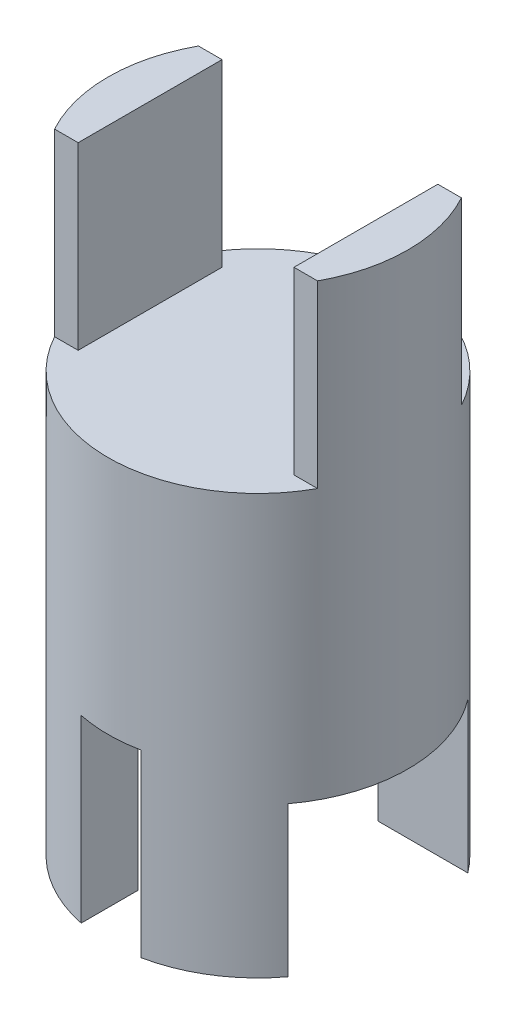
ISO-10303-21;
HEADER;
FILE_DESCRIPTION(('STEP AP214'),'2;1');
FILE_NAME('part.step','',(''),(''),'','','');
FILE_SCHEMA(('AUTOMOTIVE_DESIGN { 1 0 10303 214 1 1 1 1 }'));
ENDSEC;
DATA;
#1=APPLICATION_CONTEXT('core data for automotive mechanical design processes');
#2=APPLICATION_PROTOCOL_DEFINITION('international standard','automotive_design',2000,#1);
#3=PRODUCT_CONTEXT('',#1,'mechanical');
#4=PRODUCT('Part','Part','',(#3));
#5=PRODUCT_RELATED_PRODUCT_CATEGORY('part','',(#4));
#6=PRODUCT_DEFINITION_FORMATION('','',#4);
#7=PRODUCT_DEFINITION_CONTEXT('part definition',#1,'design');
#8=PRODUCT_DEFINITION('design','',#6,#7);
#9=PRODUCT_DEFINITION_SHAPE('','',#8);
#10=(LENGTH_UNIT() NAMED_UNIT(*) SI_UNIT(.MILLI.,.METRE.));
#11=(NAMED_UNIT(*) PLANE_ANGLE_UNIT() SI_UNIT($,.RADIAN.));
#12=(NAMED_UNIT(*) SI_UNIT($,.STERADIAN.) SOLID_ANGLE_UNIT());
#13=UNCERTAINTY_MEASURE_WITH_UNIT(LENGTH_MEASURE(1.E-05),#10,'distance_accuracy_value','');
#14=(GEOMETRIC_REPRESENTATION_CONTEXT(3) GLOBAL_UNCERTAINTY_ASSIGNED_CONTEXT((#13)) GLOBAL_UNIT_ASSIGNED_CONTEXT((#10,
#11,#12)) REPRESENTATION_CONTEXT('',''));
#15=CARTESIAN_POINT('',(0.,0.,0.));
#16=DIRECTION('',(0.,0.,1.));
#17=DIRECTION('',(1.,0.,0.));
#18=AXIS2_PLACEMENT_3D('',#15,#16,#17);
#19=CARTESIAN_POINT('',(0.,75.,0.));
#20=DIRECTION('',(0.,1.,0.));
#21=DIRECTION('',(0.,0.,1.));
#22=AXIS2_PLACEMENT_3D('',#19,#20,#21);
#23=PLANE('',#22);
#24=DIRECTION('',(0.,0.,1.));
#25=VECTOR('',#24,1.);
#26=CARTESIAN_POINT('',(-18.,75.,-25.));
#27=LINE('',#26,#25);
#28=CARTESIAN_POINT('',(-18.,75.,-12.));
#29=VERTEX_POINT('',#28);
#30=CARTESIAN_POINT('',(-18.,75.,12.));
#31=VERTEX_POINT('',#30);
#32=EDGE_CURVE('E182',#29,#31,#27,.T.);
#33=ORIENTED_EDGE('',*,*,#32,.F.);
#34=DIRECTION('',(1.,0.,0.));
#35=VECTOR('',#34,1.);
#36=CARTESIAN_POINT('',(0.,75.,-12.));
#37=LINE('',#36,#35);
#38=CARTESIAN_POINT('',(-21.9317121994613,75.,-12.));
#39=VERTEX_POINT('',#38);
#40=EDGE_CURVE('E197',#39,#29,#37,.T.);
#41=ORIENTED_EDGE('',*,*,#40,.F.);
#42=CARTESIAN_POINT('',(0.,75.,0.));
#43=DIRECTION('',(0.,1.,0.));
#44=DIRECTION('',(0.,0.,1.));
#45=AXIS2_PLACEMENT_3D('',#42,#43,#44);
#46=CIRCLE('',#45,25.);
#47=CARTESIAN_POINT('',(-21.9317121994613,75.,12.));
#48=VERTEX_POINT('',#47);
#49=EDGE_CURVE('E285',#39,#48,#46,.T.);
#50=ORIENTED_EDGE('',*,*,#49,.T.);
#51=DIRECTION('',(-1.,0.,0.));
#52=VECTOR('',#51,1.);
#53=CARTESIAN_POINT('',(0.,75.,12.));
#54=LINE('',#53,#52);
#55=EDGE_CURVE('E201',#31,#48,#54,.T.);
#56=ORIENTED_EDGE('',*,*,#55,.F.);
#57=EDGE_LOOP('',(#33,#41,#50,#56));
#58=FACE_BOUND('',#57,.T.);
#59=ADVANCED_FACE('F39',(#58),#23,.T.);
#60=CARTESIAN_POINT('',(-25.,75.,-12.));
#61=DIRECTION('',(0.,0.,1.));
#62=DIRECTION('',(0.,-1.,0.));
#63=AXIS2_PLACEMENT_3D('',#60,#61,#62);
#64=PLANE('',#63);
#65=ORIENTED_EDGE('',*,*,#40,.T.);
#66=DIRECTION('',(0.,-1.,0.));
#67=VECTOR('',#66,1.);
#68=CARTESIAN_POINT('',(-18.,75.,-12.));
#69=LINE('',#68,#67);
#70=CARTESIAN_POINT('',(-18.,45.,-12.));
#71=VERTEX_POINT('',#70);
#72=EDGE_CURVE('E345',#29,#71,#69,.T.);
#73=ORIENTED_EDGE('',*,*,#72,.T.);
#74=DIRECTION('',(1.,0.,0.));
#75=VECTOR('',#74,1.);
#76=CARTESIAN_POINT('',(-25.,45.,-12.));
#77=LINE('',#76,#75);
#78=CARTESIAN_POINT('',(-21.9317121994613,45.,-12.));
#79=VERTEX_POINT('',#78);
#80=EDGE_CURVE('E246',#79,#71,#77,.T.);
#81=ORIENTED_EDGE('',*,*,#80,.F.);
#82=DIRECTION('',(0.,1.,0.));
#83=VECTOR('',#82,1.);
#84=CARTESIAN_POINT('',(-21.9317121994613,-25.,-12.));
#85=LINE('',#84,#83);
#86=EDGE_CURVE('E254',#79,#39,#85,.T.);
#87=ORIENTED_EDGE('',*,*,#86,.T.);
#88=EDGE_LOOP('',(#65,#73,#81,#87));
#89=FACE_BOUND('',#88,.T.);
#90=ADVANCED_FACE('F374',(#89),#64,.F.);
#91=CARTESIAN_POINT('',(-25.,75.,12.));
#92=DIRECTION('',(0.,0.,-1.));
#93=DIRECTION('',(0.,1.,0.));
#94=AXIS2_PLACEMENT_3D('',#91,#92,#93);
#95=PLANE('',#94);
#96=DIRECTION('',(1.,0.,0.));
#97=VECTOR('',#96,1.);
#98=CARTESIAN_POINT('',(-25.,45.,12.));
#99=LINE('',#98,#97);
#100=CARTESIAN_POINT('',(-21.9317121994613,45.,12.));
#101=VERTEX_POINT('',#100);
#102=CARTESIAN_POINT('',(-18.,45.,12.));
#103=VERTEX_POINT('',#102);
#104=EDGE_CURVE('E252',#101,#103,#99,.T.);
#105=ORIENTED_EDGE('',*,*,#104,.T.);
#106=DIRECTION('',(0.,1.,0.));
#107=VECTOR('',#106,1.);
#108=CARTESIAN_POINT('',(-18.,75.,12.));
#109=LINE('',#108,#107);
#110=EDGE_CURVE('E191',#103,#31,#109,.T.);
#111=ORIENTED_EDGE('',*,*,#110,.T.);
#112=ORIENTED_EDGE('',*,*,#55,.T.);
#113=DIRECTION('',(0.,1.,0.));
#114=VECTOR('',#113,1.);
#115=CARTESIAN_POINT('',(-21.9317121994613,-25.,12.));
#116=LINE('',#115,#114);
#117=EDGE_CURVE('E263',#48,#101,#116,.F.);
#118=ORIENTED_EDGE('',*,*,#117,.T.);
#119=EDGE_LOOP('',(#105,#111,#112,#118));
#120=FACE_BOUND('',#119,.T.);
#121=ADVANCED_FACE('F364',(#120),#95,.F.);
#122=CARTESIAN_POINT('',(0.,-25.,0.));
#123=DIRECTION('',(0.,1.,0.));
#124=DIRECTION('',(0.,0.,1.));
#125=AXIS2_PLACEMENT_3D('',#122,#123,#124);
#126=PLANE('',#125);
#127=DIRECTION('',(1.,0.,0.));
#128=VECTOR('',#127,1.);
#129=CARTESIAN_POINT('',(0.,-25.,15.));
#130=LINE('',#129,#128);
#131=CARTESIAN_POINT('',(-20.,-25.,15.));
#132=VERTEX_POINT('',#131);
#133=CARTESIAN_POINT('',(-5.,-25.,15.));
#134=VERTEX_POINT('',#133);
#135=EDGE_CURVE('E296',#132,#134,#130,.T.);
#136=ORIENTED_EDGE('',*,*,#135,.T.);
#137=DIRECTION('',(0.,0.,1.));
#138=VECTOR('',#137,1.);
#139=CARTESIAN_POINT('',(-5.,-25.,-25.));
#140=LINE('',#139,#138);
#141=CARTESIAN_POINT('',(-5.,-25.,24.4948974278318));
#142=VERTEX_POINT('',#141);
#143=EDGE_CURVE('E238',#134,#142,#140,.T.);
#144=ORIENTED_EDGE('',*,*,#143,.T.);
#145=CARTESIAN_POINT('',(0.,-25.,0.));
#146=DIRECTION('',(0.,1.,0.));
#147=DIRECTION('',(0.,0.,1.));
#148=AXIS2_PLACEMENT_3D('',#145,#146,#147);
#149=CIRCLE('',#148,25.);
#150=EDGE_CURVE('E244',#132,#142,#149,.T.);
#151=ORIENTED_EDGE('',*,*,#150,.F.);
#152=EDGE_LOOP('',(#136,#144,#151));
#153=FACE_BOUND('',#152,.T.);
#154=ADVANCED_FACE('F390',(#153),#126,.F.);
#155=CARTESIAN_POINT('',(-5.,-25.,-24.4948974278318));
#156=VERTEX_POINT('',#155);
#157=CARTESIAN_POINT('',(-20.,-25.,-15.));
#158=VERTEX_POINT('',#157);
#159=EDGE_CURVE('E289',#156,#158,#149,.T.);
#160=ORIENTED_EDGE('',*,*,#159,.F.);
#161=CARTESIAN_POINT('',(-5.,-25.,-15.));
#162=VERTEX_POINT('',#161);
#163=EDGE_CURVE('E324',#156,#162,#140,.T.);
#164=ORIENTED_EDGE('',*,*,#163,.T.);
#165=DIRECTION('',(-1.,0.,0.));
#166=VECTOR('',#165,1.);
#167=CARTESIAN_POINT('',(0.,-25.,-15.));
#168=LINE('',#167,#166);
#169=EDGE_CURVE('E295',#162,#158,#168,.T.);
#170=ORIENTED_EDGE('',*,*,#169,.T.);
#171=EDGE_LOOP('',(#160,#164,#170));
#172=FACE_BOUND('',#171,.T.);
#173=ADVANCED_FACE('F323',(#172),#126,.F.);
#174=CARTESIAN_POINT('',(-25.,-25.,15.));
#175=DIRECTION('',(0.,0.,1.));
#176=DIRECTION('',(1.,0.,0.));
#177=AXIS2_PLACEMENT_3D('',#174,#175,#176);
#178=PLANE('',#177);
#179=DIRECTION('',(1.,0.,0.));
#180=VECTOR('',#179,1.);
#181=CARTESIAN_POINT('',(-25.,0.,15.));
#182=LINE('',#181,#180);
#183=CARTESIAN_POINT('',(-20.,0.,15.));
#184=VERTEX_POINT('',#183);
#185=CARTESIAN_POINT('',(-5.,0.,15.));
#186=VERTEX_POINT('',#185);
#187=EDGE_CURVE('E267',#184,#186,#182,.T.);
#188=ORIENTED_EDGE('',*,*,#187,.T.);
#189=DIRECTION('',(0.,-1.,0.));
#190=VECTOR('',#189,1.);
#191=CARTESIAN_POINT('',(-5.,-25.,15.));
#192=LINE('',#191,#190);
#193=EDGE_CURVE('E248',#186,#134,#192,.T.);
#194=ORIENTED_EDGE('',*,*,#193,.T.);
#195=ORIENTED_EDGE('',*,*,#135,.F.);
#196=DIRECTION('',(0.,1.,0.));
#197=VECTOR('',#196,1.);
#198=CARTESIAN_POINT('',(-20.,-25.,15.));
#199=LINE('',#198,#197);
#200=EDGE_CURVE('E279',#132,#184,#199,.T.);
#201=ORIENTED_EDGE('',*,*,#200,.T.);
#202=EDGE_LOOP('',(#188,#194,#195,#201));
#203=FACE_BOUND('',#202,.T.);
#204=ADVANCED_FACE('F329',(#203),#178,.F.);
#205=CARTESIAN_POINT('',(-25.,0.,15.));
#206=DIRECTION('',(0.,1.,0.));
#207=DIRECTION('',(0.,0.,1.));
#208=AXIS2_PLACEMENT_3D('',#205,#206,#207);
#209=PLANE('',#208);
#210=DIRECTION('',(1.,0.,0.));
#211=VECTOR('',#210,1.);
#212=CARTESIAN_POINT('',(-25.,0.,-15.));
#213=LINE('',#212,#211);
#214=CARTESIAN_POINT('',(-20.,0.,-15.));
#215=VERTEX_POINT('',#214);
#216=CARTESIAN_POINT('',(-5.,0.,-15.));
#217=VERTEX_POINT('',#216);
#218=EDGE_CURVE('E272',#215,#217,#213,.T.);
#219=ORIENTED_EDGE('',*,*,#218,.T.);
#220=DIRECTION('',(0.,0.,1.));
#221=VECTOR('',#220,1.);
#222=CARTESIAN_POINT('',(-5.,0.,15.));
#223=LINE('',#222,#221);
#224=EDGE_CURVE('E333',#217,#186,#223,.T.);
#225=ORIENTED_EDGE('',*,*,#224,.T.);
#226=ORIENTED_EDGE('',*,*,#187,.F.);
#227=CARTESIAN_POINT('',(0.,0.,0.));
#228=DIRECTION('',(0.,1.,0.));
#229=DIRECTION('',(0.,0.,1.));
#230=AXIS2_PLACEMENT_3D('',#227,#228,#229);
#231=CIRCLE('',#230,25.);
#232=EDGE_CURVE('E198',#184,#215,#231,.F.);
#233=ORIENTED_EDGE('',*,*,#232,.T.);
#234=EDGE_LOOP('',(#219,#225,#226,#233));
#235=FACE_BOUND('',#234,.T.);
#236=ADVANCED_FACE('F332',(#235),#209,.F.);
#237=CARTESIAN_POINT('',(-25.,-25.,-15.));
#238=DIRECTION('',(0.,0.,-1.));
#239=DIRECTION('',(-1.,0.,0.));
#240=AXIS2_PLACEMENT_3D('',#237,#238,#239);
#241=PLANE('',#240);
#242=ORIENTED_EDGE('',*,*,#169,.F.);
#243=DIRECTION('',(0.,1.,0.));
#244=VECTOR('',#243,1.);
#245=CARTESIAN_POINT('',(-5.,-25.,-15.));
#246=LINE('',#245,#244);
#247=EDGE_CURVE('E213',#162,#217,#246,.T.);
#248=ORIENTED_EDGE('',*,*,#247,.T.);
#249=ORIENTED_EDGE('',*,*,#218,.F.);
#250=DIRECTION('',(0.,1.,0.));
#251=VECTOR('',#250,1.);
#252=CARTESIAN_POINT('',(-20.,-25.,-15.));
#253=LINE('',#252,#251);
#254=EDGE_CURVE('E276',#215,#158,#253,.F.);
#255=ORIENTED_EDGE('',*,*,#254,.T.);
#256=EDGE_LOOP('',(#242,#248,#249,#255));
#257=FACE_BOUND('',#256,.T.);
#258=ADVANCED_FACE('F325',(#257),#241,.F.);
#259=CARTESIAN_POINT('',(5.,-25.,24.4948974278318));
#260=VERTEX_POINT('',#259);
#261=CARTESIAN_POINT('',(20.,-25.,15.));
#262=VERTEX_POINT('',#261);
#263=EDGE_CURVE('E290',#260,#262,#149,.T.);
#264=ORIENTED_EDGE('',*,*,#263,.F.);
#265=DIRECTION('',(0.,0.,1.));
#266=VECTOR('',#265,1.);
#267=CARTESIAN_POINT('',(5.,-25.,-25.));
#268=LINE('',#267,#266);
#269=CARTESIAN_POINT('',(5.,-25.,15.));
#270=VERTEX_POINT('',#269);
#271=EDGE_CURVE('E306',#270,#260,#268,.T.);
#272=ORIENTED_EDGE('',*,*,#271,.F.);
#273=EDGE_CURVE('E294',#270,#262,#130,.T.);
#274=ORIENTED_EDGE('',*,*,#273,.T.);
#275=EDGE_LOOP('',(#264,#272,#274));
#276=FACE_BOUND('',#275,.T.);
#277=ADVANCED_FACE('F305',(#276),#126,.F.);
#278=CARTESIAN_POINT('',(0.,-25.,0.));
#279=DIRECTION('',(0.,1.,0.));
#280=DIRECTION('',(0.,0.,1.));
#281=AXIS2_PLACEMENT_3D('',#278,#279,#280);
#282=CYLINDRICAL_SURFACE('',#281,25.);
#283=DIRECTION('',(0.,1.,0.));
#284=VECTOR('',#283,1.);
#285=CARTESIAN_POINT('',(-5.,-25.,24.4948974278318));
#286=LINE('',#285,#284);
#287=CARTESIAN_POINT('',(-5.,5.,24.4948974278318));
#288=VERTEX_POINT('',#287);
#289=EDGE_CURVE('E234',#288,#142,#286,.F.);
#290=ORIENTED_EDGE('',*,*,#289,.F.);
#291=CARTESIAN_POINT('',(0.,5.,0.));
#292=DIRECTION('',(0.,1.,0.));
#293=DIRECTION('',(0.,0.,1.));
#294=AXIS2_PLACEMENT_3D('',#291,#292,#293);
#295=CIRCLE('',#294,25.);
#296=CARTESIAN_POINT('',(5.,5.,24.4948974278318));
#297=VERTEX_POINT('',#296);
#298=EDGE_CURVE('E43',#297,#288,#295,.F.);
#299=ORIENTED_EDGE('',*,*,#298,.F.);
#300=DIRECTION('',(0.,1.,0.));
#301=VECTOR('',#300,1.);
#302=CARTESIAN_POINT('',(5.,-25.,24.4948974278318));
#303=LINE('',#302,#301);
#304=EDGE_CURVE('E314',#260,#297,#303,.T.);
#305=ORIENTED_EDGE('',*,*,#304,.F.);
#306=ORIENTED_EDGE('',*,*,#263,.T.);
#307=DIRECTION('',(0.,1.,0.));
#308=VECTOR('',#307,1.);
#309=CARTESIAN_POINT('',(20.,-25.,15.));
#310=LINE('',#309,#308);
#311=CARTESIAN_POINT('',(20.,0.,15.));
#312=VERTEX_POINT('',#311);
#313=EDGE_CURVE('E282',#312,#262,#310,.F.);
#314=ORIENTED_EDGE('',*,*,#313,.F.);
#315=CARTESIAN_POINT('',(20.,0.,-15.));
#316=VERTEX_POINT('',#315);
#317=EDGE_CURVE('E202',#316,#312,#231,.F.);
#318=ORIENTED_EDGE('',*,*,#317,.F.);
#319=DIRECTION('',(0.,1.,0.));
#320=VECTOR('',#319,1.);
#321=CARTESIAN_POINT('',(20.,-25.,-15.));
#322=LINE('',#321,#320);
#323=CARTESIAN_POINT('',(20.,-25.,-15.));
#324=VERTEX_POINT('',#323);
#325=EDGE_CURVE('E270',#324,#316,#322,.T.);
#326=ORIENTED_EDGE('',*,*,#325,.F.);
#327=CARTESIAN_POINT('',(5.,-25.,-24.4948974278318));
#328=VERTEX_POINT('',#327);
#329=EDGE_CURVE('E291',#324,#328,#149,.T.);
#330=ORIENTED_EDGE('',*,*,#329,.T.);
#331=DIRECTION('',(0.,1.,0.));
#332=VECTOR('',#331,1.);
#333=CARTESIAN_POINT('',(5.,-25.,-24.4948974278318));
#334=LINE('',#333,#332);
#335=CARTESIAN_POINT('',(5.,5.,-24.4948974278318));
#336=VERTEX_POINT('',#335);
#337=EDGE_CURVE('E334',#336,#328,#334,.F.);
#338=ORIENTED_EDGE('',*,*,#337,.F.);
#339=CARTESIAN_POINT('',(-5.,5.,-24.4948974278318));
#340=VERTEX_POINT('',#339);
#341=EDGE_CURVE('E11',#340,#336,#295,.F.);
#342=ORIENTED_EDGE('',*,*,#341,.F.);
#343=DIRECTION('',(0.,1.,0.));
#344=VECTOR('',#343,1.);
#345=CARTESIAN_POINT('',(-5.,-25.,-24.4948974278318));
#346=LINE('',#345,#344);
#347=EDGE_CURVE('E237',#156,#340,#346,.T.);
#348=ORIENTED_EDGE('',*,*,#347,.F.);
#349=ORIENTED_EDGE('',*,*,#159,.T.);
#350=ORIENTED_EDGE('',*,*,#254,.F.);
#351=ORIENTED_EDGE('',*,*,#232,.F.);
#352=ORIENTED_EDGE('',*,*,#200,.F.);
#353=ORIENTED_EDGE('',*,*,#150,.T.);
#354=EDGE_LOOP('',(#290,#299,#305,#306,#314,#318,#326,#330,#338,#342,#348,#349,#350,#351,#352,#353));
#355=FACE_BOUND('',#354,.T.);
#356=ORIENTED_EDGE('',*,*,#117,.F.);
#357=ORIENTED_EDGE('',*,*,#49,.F.);
#358=ORIENTED_EDGE('',*,*,#86,.F.);
#359=CARTESIAN_POINT('',(0.,45.,0.));
#360=DIRECTION('',(0.,-1.,0.));
#361=DIRECTION('',(0.,0.,-1.));
#362=AXIS2_PLACEMENT_3D('',#359,#360,#361);
#363=CIRCLE('',#362,25.);
#364=CARTESIAN_POINT('',(21.9317121994613,45.,-12.));
#365=VERTEX_POINT('',#364);
#366=EDGE_CURVE('E208',#365,#79,#363,.F.);
#367=ORIENTED_EDGE('',*,*,#366,.F.);
#368=DIRECTION('',(0.,1.,0.));
#369=VECTOR('',#368,1.);
#370=CARTESIAN_POINT('',(21.9317121994613,-25.,-12.));
#371=LINE('',#370,#369);
#372=CARTESIAN_POINT('',(21.9317121994613,75.,-12.));
#373=VERTEX_POINT('',#372);
#374=EDGE_CURVE('E259',#373,#365,#371,.F.);
#375=ORIENTED_EDGE('',*,*,#374,.F.);
#376=CARTESIAN_POINT('',(21.9317121994613,75.,12.));
#377=VERTEX_POINT('',#376);
#378=EDGE_CURVE('E196',#377,#373,#46,.T.);
#379=ORIENTED_EDGE('',*,*,#378,.F.);
#380=DIRECTION('',(0.,1.,0.));
#381=VECTOR('',#380,1.);
#382=CARTESIAN_POINT('',(21.9317121994613,-25.,12.));
#383=LINE('',#382,#381);
#384=CARTESIAN_POINT('',(21.9317121994613,45.,12.));
#385=VERTEX_POINT('',#384);
#386=EDGE_CURVE('E261',#385,#377,#383,.T.);
#387=ORIENTED_EDGE('',*,*,#386,.F.);
#388=CARTESIAN_POINT('',(0.,45.,0.));
#389=DIRECTION('',(0.,-1.,0.));
#390=DIRECTION('',(0.,0.,-1.));
#391=AXIS2_PLACEMENT_3D('',#388,#389,#390);
#392=CIRCLE('',#391,25.);
#393=EDGE_CURVE('E210',#101,#385,#392,.F.);
#394=ORIENTED_EDGE('',*,*,#393,.F.);
#395=EDGE_LOOP('',(#356,#357,#358,#367,#375,#379,#387,#394));
#396=FACE_BOUND('',#395,.T.);
#397=ADVANCED_FACE('F41',(#355,#396),#282,.T.);
#398=CARTESIAN_POINT('',(5.,-25.,-15.));
#399=VERTEX_POINT('',#398);
#400=EDGE_CURVE('E292',#324,#399,#168,.T.);
#401=ORIENTED_EDGE('',*,*,#400,.T.);
#402=EDGE_CURVE('E62',#328,#399,#268,.T.);
#403=ORIENTED_EDGE('',*,*,#402,.F.);
#404=ORIENTED_EDGE('',*,*,#329,.F.);
#405=EDGE_LOOP('',(#401,#403,#404));
#406=FACE_BOUND('',#405,.T.);
#407=ADVANCED_FACE('F399',(#406),#126,.F.);
#408=DIRECTION('',(0.,0.,1.));
#409=VECTOR('',#408,1.);
#410=CARTESIAN_POINT('',(18.,75.,-25.));
#411=LINE('',#410,#409);
#412=CARTESIAN_POINT('',(18.,75.,-12.));
#413=VERTEX_POINT('',#412);
#414=CARTESIAN_POINT('',(18.,75.,12.));
#415=VERTEX_POINT('',#414);
#416=EDGE_CURVE('E173',#413,#415,#411,.T.);
#417=ORIENTED_EDGE('',*,*,#416,.T.);
#418=EDGE_CURVE('E206',#377,#415,#54,.T.);
#419=ORIENTED_EDGE('',*,*,#418,.F.);
#420=ORIENTED_EDGE('',*,*,#378,.T.);
#421=EDGE_CURVE('E188',#413,#373,#37,.T.);
#422=ORIENTED_EDGE('',*,*,#421,.F.);
#423=EDGE_LOOP('',(#417,#419,#420,#422));
#424=FACE_BOUND('',#423,.T.);
#425=ADVANCED_FACE('F194',(#424),#23,.T.);
#426=ORIENTED_EDGE('',*,*,#273,.F.);
#427=DIRECTION('',(0.,1.,0.));
#428=VECTOR('',#427,1.);
#429=CARTESIAN_POINT('',(5.,-25.,15.));
#430=LINE('',#429,#428);
#431=CARTESIAN_POINT('',(5.,0.,15.));
#432=VERTEX_POINT('',#431);
#433=EDGE_CURVE('E339',#270,#432,#430,.T.);
#434=ORIENTED_EDGE('',*,*,#433,.T.);
#435=EDGE_CURVE('E271',#432,#312,#182,.T.);
#436=ORIENTED_EDGE('',*,*,#435,.T.);
#437=ORIENTED_EDGE('',*,*,#313,.T.);
#438=EDGE_LOOP('',(#426,#434,#436,#437));
#439=FACE_BOUND('',#438,.T.);
#440=ADVANCED_FACE('F310',(#439),#178,.F.);
#441=ORIENTED_EDGE('',*,*,#435,.F.);
#442=DIRECTION('',(0.,0.,-1.));
#443=VECTOR('',#442,1.);
#444=CARTESIAN_POINT('',(5.,0.,15.));
#445=LINE('',#444,#443);
#446=CARTESIAN_POINT('',(5.,0.,-15.));
#447=VERTEX_POINT('',#446);
#448=EDGE_CURVE('E341',#432,#447,#445,.T.);
#449=ORIENTED_EDGE('',*,*,#448,.T.);
#450=EDGE_CURVE('E266',#447,#316,#213,.T.);
#451=ORIENTED_EDGE('',*,*,#450,.T.);
#452=ORIENTED_EDGE('',*,*,#317,.T.);
#453=EDGE_LOOP('',(#441,#449,#451,#452));
#454=FACE_BOUND('',#453,.T.);
#455=ADVANCED_FACE('F404',(#454),#209,.F.);
#456=ORIENTED_EDGE('',*,*,#450,.F.);
#457=DIRECTION('',(0.,-1.,0.));
#458=VECTOR('',#457,1.);
#459=CARTESIAN_POINT('',(5.,-25.,-15.));
#460=LINE('',#459,#458);
#461=EDGE_CURVE('E212',#447,#399,#460,.T.);
#462=ORIENTED_EDGE('',*,*,#461,.T.);
#463=ORIENTED_EDGE('',*,*,#400,.F.);
#464=ORIENTED_EDGE('',*,*,#325,.T.);
#465=EDGE_LOOP('',(#456,#462,#463,#464));
#466=FACE_BOUND('',#465,.T.);
#467=ADVANCED_FACE('F386',(#466),#241,.F.);
#468=CARTESIAN_POINT('',(18.,45.,-12.));
#469=VERTEX_POINT('',#468);
#470=EDGE_CURVE('E190',#469,#365,#77,.T.);
#471=ORIENTED_EDGE('',*,*,#470,.F.);
#472=DIRECTION('',(0.,1.,0.));
#473=VECTOR('',#472,1.);
#474=CARTESIAN_POINT('',(18.,75.,-12.));
#475=LINE('',#474,#473);
#476=EDGE_CURVE('E176',#469,#413,#475,.T.);
#477=ORIENTED_EDGE('',*,*,#476,.T.);
#478=ORIENTED_EDGE('',*,*,#421,.T.);
#479=ORIENTED_EDGE('',*,*,#374,.T.);
#480=EDGE_LOOP('',(#471,#477,#478,#479));
#481=FACE_BOUND('',#480,.T.);
#482=ADVANCED_FACE('F186',(#481),#64,.F.);
#483=ORIENTED_EDGE('',*,*,#418,.T.);
#484=DIRECTION('',(0.,-1.,0.));
#485=VECTOR('',#484,1.);
#486=CARTESIAN_POINT('',(18.,75.,12.));
#487=LINE('',#486,#485);
#488=CARTESIAN_POINT('',(18.,45.,12.));
#489=VERTEX_POINT('',#488);
#490=EDGE_CURVE('E177',#415,#489,#487,.T.);
#491=ORIENTED_EDGE('',*,*,#490,.T.);
#492=EDGE_CURVE('E255',#489,#385,#99,.T.);
#493=ORIENTED_EDGE('',*,*,#492,.T.);
#494=ORIENTED_EDGE('',*,*,#386,.T.);
#495=EDGE_LOOP('',(#483,#491,#493,#494));
#496=FACE_BOUND('',#495,.T.);
#497=ADVANCED_FACE('F378',(#496),#95,.F.);
#498=CARTESIAN_POINT('',(-25.,45.,25.));
#499=DIRECTION('',(0.,-1.,0.));
#500=DIRECTION('',(0.,0.,-1.));
#501=AXIS2_PLACEMENT_3D('',#498,#499,#500);
#502=PLANE('',#501);
#503=ORIENTED_EDGE('',*,*,#492,.F.);
#504=DIRECTION('',(0.,0.,1.));
#505=VECTOR('',#504,1.);
#506=CARTESIAN_POINT('',(18.,45.,-25.));
#507=LINE('',#506,#505);
#508=EDGE_CURVE('E54',#469,#489,#507,.T.);
#509=ORIENTED_EDGE('',*,*,#508,.F.);
#510=ORIENTED_EDGE('',*,*,#470,.T.);
#511=ORIENTED_EDGE('',*,*,#366,.T.);
#512=ORIENTED_EDGE('',*,*,#80,.T.);
#513=DIRECTION('',(0.,0.,1.));
#514=VECTOR('',#513,1.);
#515=CARTESIAN_POINT('',(-18.,45.,-25.));
#516=LINE('',#515,#514);
#517=EDGE_CURVE('E353',#71,#103,#516,.T.);
#518=ORIENTED_EDGE('',*,*,#517,.T.);
#519=ORIENTED_EDGE('',*,*,#104,.F.);
#520=ORIENTED_EDGE('',*,*,#393,.T.);
#521=EDGE_LOOP('',(#503,#509,#510,#511,#512,#518,#519,#520));
#522=FACE_BOUND('',#521,.T.);
#523=ADVANCED_FACE('F360',(#522),#502,.F.);
#524=CARTESIAN_POINT('',(-5.,-25.,-25.));
#525=DIRECTION('',(-1.,0.,0.));
#526=DIRECTION('',(0.,0.,1.));
#527=AXIS2_PLACEMENT_3D('',#524,#525,#526);
#528=PLANE('',#527);
#529=ORIENTED_EDGE('',*,*,#289,.T.);
#530=ORIENTED_EDGE('',*,*,#143,.F.);
#531=ORIENTED_EDGE('',*,*,#193,.F.);
#532=ORIENTED_EDGE('',*,*,#224,.F.);
#533=ORIENTED_EDGE('',*,*,#247,.F.);
#534=ORIENTED_EDGE('',*,*,#163,.F.);
#535=ORIENTED_EDGE('',*,*,#347,.T.);
#536=DIRECTION('',(0.,0.,1.));
#537=VECTOR('',#536,1.);
#538=CARTESIAN_POINT('',(-5.,5.,-25.));
#539=LINE('',#538,#537);
#540=EDGE_CURVE('E225',#340,#288,#539,.T.);
#541=ORIENTED_EDGE('',*,*,#540,.T.);
#542=EDGE_LOOP('',(#529,#530,#531,#532,#533,#534,#535,#541));
#543=FACE_BOUND('',#542,.T.);
#544=ADVANCED_FACE('F233',(#543),#528,.F.);
#545=CARTESIAN_POINT('',(5.,-25.,-25.));
#546=DIRECTION('',(1.,0.,0.));
#547=DIRECTION('',(0.,0.,-1.));
#548=AXIS2_PLACEMENT_3D('',#545,#546,#547);
#549=PLANE('',#548);
#550=ORIENTED_EDGE('',*,*,#337,.T.);
#551=ORIENTED_EDGE('',*,*,#402,.T.);
#552=ORIENTED_EDGE('',*,*,#461,.F.);
#553=ORIENTED_EDGE('',*,*,#448,.F.);
#554=ORIENTED_EDGE('',*,*,#433,.F.);
#555=ORIENTED_EDGE('',*,*,#271,.T.);
#556=ORIENTED_EDGE('',*,*,#304,.T.);
#557=DIRECTION('',(0.,0.,1.));
#558=VECTOR('',#557,1.);
#559=CARTESIAN_POINT('',(5.,5.,-25.));
#560=LINE('',#559,#558);
#561=EDGE_CURVE('E227',#336,#297,#560,.T.);
#562=ORIENTED_EDGE('',*,*,#561,.F.);
#563=EDGE_LOOP('',(#550,#551,#552,#553,#554,#555,#556,#562));
#564=FACE_BOUND('',#563,.T.);
#565=ADVANCED_FACE('F431',(#564),#549,.F.);
#566=CARTESIAN_POINT('',(-5.,5.,-25.));
#567=DIRECTION('',(0.,1.,0.));
#568=DIRECTION('',(0.,0.,1.));
#569=AXIS2_PLACEMENT_3D('',#566,#567,#568);
#570=PLANE('',#569);
#571=ORIENTED_EDGE('',*,*,#540,.F.);
#572=ORIENTED_EDGE('',*,*,#341,.T.);
#573=ORIENTED_EDGE('',*,*,#561,.T.);
#574=ORIENTED_EDGE('',*,*,#298,.T.);
#575=EDGE_LOOP('',(#571,#572,#573,#574));
#576=FACE_BOUND('',#575,.T.);
#577=ADVANCED_FACE('F224',(#576),#570,.F.);
#578=CARTESIAN_POINT('',(-18.,45.,-25.));
#579=DIRECTION('',(-1.,0.,0.));
#580=DIRECTION('',(0.,0.,1.));
#581=AXIS2_PLACEMENT_3D('',#578,#579,#580);
#582=PLANE('',#581);
#583=ORIENTED_EDGE('',*,*,#32,.T.);
#584=ORIENTED_EDGE('',*,*,#110,.F.);
#585=ORIENTED_EDGE('',*,*,#517,.F.);
#586=ORIENTED_EDGE('',*,*,#72,.F.);
#587=EDGE_LOOP('',(#583,#584,#585,#586));
#588=FACE_BOUND('',#587,.T.);
#589=ADVANCED_FACE('F435',(#588),#582,.F.);
#590=CARTESIAN_POINT('',(18.,45.,-25.));
#591=DIRECTION('',(1.,0.,0.));
#592=DIRECTION('',(0.,0.,-1.));
#593=AXIS2_PLACEMENT_3D('',#590,#591,#592);
#594=PLANE('',#593);
#595=ORIENTED_EDGE('',*,*,#508,.T.);
#596=ORIENTED_EDGE('',*,*,#490,.F.);
#597=ORIENTED_EDGE('',*,*,#416,.F.);
#598=ORIENTED_EDGE('',*,*,#476,.F.);
#599=EDGE_LOOP('',(#595,#596,#597,#598));
#600=FACE_BOUND('',#599,.T.);
#601=ADVANCED_FACE('F175',(#600),#594,.F.);
#602=CLOSED_SHELL('',(#59,#90,#121,#154,#173,#204,#236,#258,#277,#397,#407,#425,#440,#455,#467,
#482,#497,#523,#544,#565,#577,#589,#601));
#603=MANIFOLD_SOLID_BREP('B2',#602);
#604=ADVANCED_BREP_SHAPE_REPRESENTATION('',(#18,#603),#14);
#605=SHAPE_DEFINITION_REPRESENTATION(#9,#604);
ENDSEC;
END-ISO-10303-21;
